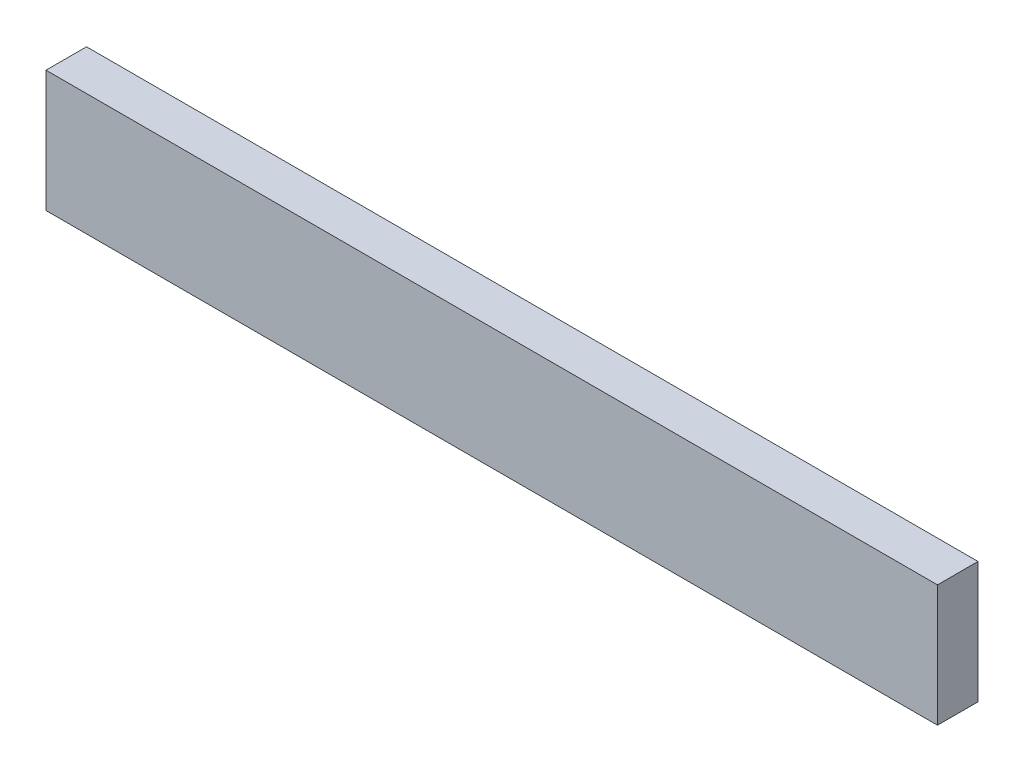
ISO-10303-21;
HEADER;
FILE_DESCRIPTION(('STEP AP214'),'2;1');
FILE_NAME('part.step','',(''),(''),'','','');
FILE_SCHEMA(('AUTOMOTIVE_DESIGN { 1 0 10303 214 1 1 1 1 }'));
ENDSEC;
DATA;
#1=APPLICATION_CONTEXT('core data for automotive mechanical design processes');
#2=APPLICATION_PROTOCOL_DEFINITION('international standard','automotive_design',2000,#1);
#3=PRODUCT_CONTEXT('',#1,'mechanical');
#4=PRODUCT('Part','Part','',(#3));
#5=PRODUCT_RELATED_PRODUCT_CATEGORY('part','',(#4));
#6=PRODUCT_DEFINITION_FORMATION('','',#4);
#7=PRODUCT_DEFINITION_CONTEXT('part definition',#1,'design');
#8=PRODUCT_DEFINITION('design','',#6,#7);
#9=PRODUCT_DEFINITION_SHAPE('','',#8);
#10=(LENGTH_UNIT() NAMED_UNIT(*) SI_UNIT(.MILLI.,.METRE.));
#11=(NAMED_UNIT(*) PLANE_ANGLE_UNIT() SI_UNIT($,.RADIAN.));
#12=(NAMED_UNIT(*) SI_UNIT($,.STERADIAN.) SOLID_ANGLE_UNIT());
#13=UNCERTAINTY_MEASURE_WITH_UNIT(LENGTH_MEASURE(1.E-05),#10,'distance_accuracy_value','');
#14=(GEOMETRIC_REPRESENTATION_CONTEXT(3) GLOBAL_UNCERTAINTY_ASSIGNED_CONTEXT((#13)) GLOBAL_UNIT_ASSIGNED_CONTEXT((#10,
#11,#12)) REPRESENTATION_CONTEXT('',''));
#15=CARTESIAN_POINT('',(0.,0.,0.));
#16=DIRECTION('',(0.,0.,1.));
#17=DIRECTION('',(1.,0.,0.));
#18=AXIS2_PLACEMENT_3D('',#15,#16,#17);
#19=CARTESIAN_POINT('',(-58.906999704952,-13.1949830642247,5.));
#20=DIRECTION('',(1.,0.,0.));
#21=DIRECTION('',(0.,1.,0.));
#22=AXIS2_PLACEMENT_3D('',#19,#20,#21);
#23=PLANE('',#22);
#24=DIRECTION('',(0.,-1.,0.));
#25=VECTOR('',#24,1.);
#26=CARTESIAN_POINT('',(-58.906999704952,-13.1949830642247,0.));
#27=LINE('',#26,#25);
#28=CARTESIAN_POINT('',(-58.906999704952,-13.1949830642247,0.));
#29=VERTEX_POINT('',#28);
#30=CARTESIAN_POINT('',(-58.9069997049521,-28.1949830642247,0.));
#31=VERTEX_POINT('',#30);
#32=EDGE_CURVE('E96',#29,#31,#27,.T.);
#33=ORIENTED_EDGE('',*,*,#32,.T.);
#34=DIRECTION('',(0.,0.,-1.));
#35=VECTOR('',#34,1.);
#36=CARTESIAN_POINT('',(-58.9069997049521,-28.1949830642247,5.));
#37=LINE('',#36,#35);
#38=CARTESIAN_POINT('',(-58.9069997049521,-28.1949830642247,5.));
#39=VERTEX_POINT('',#38);
#40=EDGE_CURVE('E11',#39,#31,#37,.T.);
#41=ORIENTED_EDGE('',*,*,#40,.F.);
#42=DIRECTION('',(0.,-1.,0.));
#43=VECTOR('',#42,1.);
#44=CARTESIAN_POINT('',(-58.906999704952,-13.1949830642247,5.));
#45=LINE('',#44,#43);
#46=CARTESIAN_POINT('',(-58.906999704952,-13.1949830642247,5.));
#47=VERTEX_POINT('',#46);
#48=EDGE_CURVE('E84',#47,#39,#45,.T.);
#49=ORIENTED_EDGE('',*,*,#48,.F.);
#50=DIRECTION('',(0.,0.,-1.));
#51=VECTOR('',#50,1.);
#52=CARTESIAN_POINT('',(-58.906999704952,-13.1949830642247,5.));
#53=LINE('',#52,#51);
#54=EDGE_CURVE('E92',#47,#29,#53,.T.);
#55=ORIENTED_EDGE('',*,*,#54,.T.);
#56=EDGE_LOOP('',(#33,#41,#49,#55));
#57=FACE_BOUND('',#56,.T.);
#58=ADVANCED_FACE('F33',(#57),#23,.F.);
#59=CARTESIAN_POINT('',(-58.9069997049521,-28.1949830642247,5.));
#60=DIRECTION('',(0.,1.,0.));
#61=DIRECTION('',(0.,0.,1.));
#62=AXIS2_PLACEMENT_3D('',#59,#60,#61);
#63=PLANE('',#62);
#64=DIRECTION('',(1.,0.,0.));
#65=VECTOR('',#64,1.);
#66=CARTESIAN_POINT('',(-58.9069997049521,-28.1949830642247,0.));
#67=LINE('',#66,#65);
#68=CARTESIAN_POINT('',(51.0930002950479,-28.1949830642247,0.));
#69=VERTEX_POINT('',#68);
#70=EDGE_CURVE('E88',#31,#69,#67,.T.);
#71=ORIENTED_EDGE('',*,*,#70,.T.);
#72=DIRECTION('',(0.,0.,-1.));
#73=VECTOR('',#72,1.);
#74=CARTESIAN_POINT('',(51.0930002950479,-28.1949830642247,5.));
#75=LINE('',#74,#73);
#76=CARTESIAN_POINT('',(51.0930002950479,-28.1949830642247,5.));
#77=VERTEX_POINT('',#76);
#78=EDGE_CURVE('E41',#77,#69,#75,.T.);
#79=ORIENTED_EDGE('',*,*,#78,.F.);
#80=DIRECTION('',(1.,0.,0.));
#81=VECTOR('',#80,1.);
#82=CARTESIAN_POINT('',(-58.9069997049521,-28.1949830642247,5.));
#83=LINE('',#82,#81);
#84=EDGE_CURVE('E79',#39,#77,#83,.T.);
#85=ORIENTED_EDGE('',*,*,#84,.F.);
#86=ORIENTED_EDGE('',*,*,#40,.T.);
#87=EDGE_LOOP('',(#71,#79,#85,#86));
#88=FACE_BOUND('',#87,.T.);
#89=ADVANCED_FACE('F87',(#88),#63,.F.);
#90=CARTESIAN_POINT('',(51.0930002950479,-13.1949830642247,5.));
#91=DIRECTION('',(-1.,0.,0.));
#92=DIRECTION('',(0.,-1.,0.));
#93=AXIS2_PLACEMENT_3D('',#90,#91,#92);
#94=PLANE('',#93);
#95=DIRECTION('',(0.,1.,0.));
#96=VECTOR('',#95,1.);
#97=CARTESIAN_POINT('',(51.0930002950479,-13.1949830642247,0.));
#98=LINE('',#97,#96);
#99=CARTESIAN_POINT('',(51.0930002950479,-13.1949830642247,0.));
#100=VERTEX_POINT('',#99);
#101=EDGE_CURVE('E66',#69,#100,#98,.T.);
#102=ORIENTED_EDGE('',*,*,#101,.T.);
#103=DIRECTION('',(0.,0.,-1.));
#104=VECTOR('',#103,1.);
#105=CARTESIAN_POINT('',(51.0930002950479,-13.1949830642247,5.));
#106=LINE('',#105,#104);
#107=CARTESIAN_POINT('',(51.0930002950479,-13.1949830642247,5.));
#108=VERTEX_POINT('',#107);
#109=EDGE_CURVE('E89',#108,#100,#106,.T.);
#110=ORIENTED_EDGE('',*,*,#109,.F.);
#111=DIRECTION('',(0.,1.,0.));
#112=VECTOR('',#111,1.);
#113=CARTESIAN_POINT('',(51.0930002950479,-13.1949830642247,5.));
#114=LINE('',#113,#112);
#115=EDGE_CURVE('E82',#77,#108,#114,.T.);
#116=ORIENTED_EDGE('',*,*,#115,.F.);
#117=ORIENTED_EDGE('',*,*,#78,.T.);
#118=EDGE_LOOP('',(#102,#110,#116,#117));
#119=FACE_BOUND('',#118,.T.);
#120=ADVANCED_FACE('F90',(#119),#94,.F.);
#121=CARTESIAN_POINT('',(-58.906999704952,-13.1949830642247,5.));
#122=DIRECTION('',(0.,-1.,0.));
#123=DIRECTION('',(0.,0.,-1.));
#124=AXIS2_PLACEMENT_3D('',#121,#122,#123);
#125=PLANE('',#124);
#126=DIRECTION('',(-1.,0.,0.));
#127=VECTOR('',#126,1.);
#128=CARTESIAN_POINT('',(-58.906999704952,-13.1949830642247,0.));
#129=LINE('',#128,#127);
#130=EDGE_CURVE('E72',#100,#29,#129,.T.);
#131=ORIENTED_EDGE('',*,*,#130,.T.);
#132=ORIENTED_EDGE('',*,*,#54,.F.);
#133=DIRECTION('',(-1.,0.,0.));
#134=VECTOR('',#133,1.);
#135=CARTESIAN_POINT('',(-58.906999704952,-13.1949830642247,5.));
#136=LINE('',#135,#134);
#137=EDGE_CURVE('E49',#108,#47,#136,.T.);
#138=ORIENTED_EDGE('',*,*,#137,.F.);
#139=ORIENTED_EDGE('',*,*,#109,.T.);
#140=EDGE_LOOP('',(#131,#132,#138,#139));
#141=FACE_BOUND('',#140,.T.);
#142=ADVANCED_FACE('F103',(#141),#125,.F.);
#143=CARTESIAN_POINT('',(0.,0.,5.));
#144=DIRECTION('',(0.,0.,1.));
#145=DIRECTION('',(1.,0.,0.));
#146=AXIS2_PLACEMENT_3D('',#143,#144,#145);
#147=PLANE('',#146);
#148=ORIENTED_EDGE('',*,*,#48,.T.);
#149=ORIENTED_EDGE('',*,*,#84,.T.);
#150=ORIENTED_EDGE('',*,*,#115,.T.);
#151=ORIENTED_EDGE('',*,*,#137,.T.);
#152=EDGE_LOOP('',(#148,#149,#150,#151));
#153=FACE_BOUND('',#152,.T.);
#154=ADVANCED_FACE('F80',(#153),#147,.T.);
#155=CARTESIAN_POINT('',(0.,0.,0.));
#156=DIRECTION('',(0.,0.,1.));
#157=DIRECTION('',(1.,0.,0.));
#158=AXIS2_PLACEMENT_3D('',#155,#156,#157);
#159=PLANE('',#158);
#160=ORIENTED_EDGE('',*,*,#32,.F.);
#161=ORIENTED_EDGE('',*,*,#130,.F.);
#162=ORIENTED_EDGE('',*,*,#101,.F.);
#163=ORIENTED_EDGE('',*,*,#70,.F.);
#164=EDGE_LOOP('',(#160,#161,#162,#163));
#165=FACE_BOUND('',#164,.T.);
#166=ADVANCED_FACE('F106',(#165),#159,.F.);
#167=CLOSED_SHELL('',(#58,#89,#120,#142,#154,#166));
#168=MANIFOLD_SOLID_BREP('B2',#167);
#169=ADVANCED_BREP_SHAPE_REPRESENTATION('',(#18,#168),#14);
#170=SHAPE_DEFINITION_REPRESENTATION(#9,#169);
ENDSEC;
END-ISO-10303-21;
